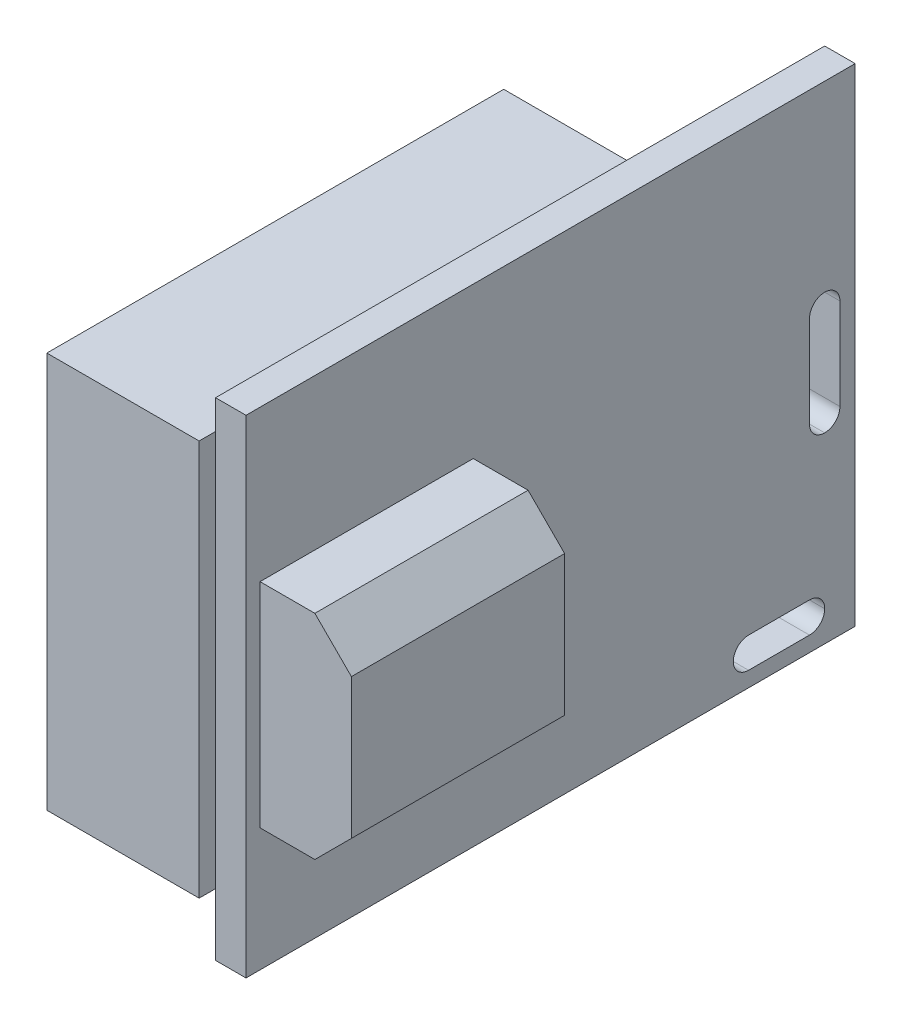
ISO-10303-21;
HEADER;
FILE_DESCRIPTION(('STEP AP214'),'2;1');
FILE_NAME('part.step','',(''),(''),'','','');
FILE_SCHEMA(('AUTOMOTIVE_DESIGN { 1 0 10303 214 1 1 1 1 }'));
ENDSEC;
DATA;
#1=APPLICATION_CONTEXT('core data for automotive mechanical design processes');
#2=APPLICATION_PROTOCOL_DEFINITION('international standard','automotive_design',2000,#1);
#3=PRODUCT_CONTEXT('',#1,'mechanical');
#4=PRODUCT('Part','Part','',(#3));
#5=PRODUCT_RELATED_PRODUCT_CATEGORY('part','',(#4));
#6=PRODUCT_DEFINITION_FORMATION('','',#4);
#7=PRODUCT_DEFINITION_CONTEXT('part definition',#1,'design');
#8=PRODUCT_DEFINITION('design','',#6,#7);
#9=PRODUCT_DEFINITION_SHAPE('','',#8);
#10=(LENGTH_UNIT() NAMED_UNIT(*) SI_UNIT(.MILLI.,.METRE.));
#11=(NAMED_UNIT(*) PLANE_ANGLE_UNIT() SI_UNIT($,.RADIAN.));
#12=(NAMED_UNIT(*) SI_UNIT($,.STERADIAN.) SOLID_ANGLE_UNIT());
#13=UNCERTAINTY_MEASURE_WITH_UNIT(LENGTH_MEASURE(1.E-05),#10,'distance_accuracy_value','');
#14=(GEOMETRIC_REPRESENTATION_CONTEXT(3) GLOBAL_UNCERTAINTY_ASSIGNED_CONTEXT((#13)) GLOBAL_UNIT_ASSIGNED_CONTEXT((#10,
#11,#12)) REPRESENTATION_CONTEXT('',''));
#15=CARTESIAN_POINT('',(0.,0.,0.));
#16=DIRECTION('',(0.,0.,1.));
#17=DIRECTION('',(1.,0.,0.));
#18=AXIS2_PLACEMENT_3D('',#15,#16,#17);
#19=CARTESIAN_POINT('',(7.5,-3.5,-7.));
#20=DIRECTION('',(0.,1.,0.));
#21=DIRECTION('',(-1.,0.,0.));
#22=AXIS2_PLACEMENT_3D('',#19,#20,#21);
#23=PLANE('',#22);
#24=DIRECTION('',(-1.,0.,0.));
#25=VECTOR('',#24,1.);
#26=CARTESIAN_POINT('',(7.5,-3.5,-7.));
#27=LINE('',#26,#25);
#28=CARTESIAN_POINT('',(6.3,-3.5,-7.));
#29=VERTEX_POINT('',#28);
#30=CARTESIAN_POINT('',(4.5,-3.5,-7.));
#31=VERTEX_POINT('',#30);
#32=EDGE_CURVE('E98',#29,#31,#27,.T.);
#33=ORIENTED_EDGE('',*,*,#32,.F.);
#34=DIRECTION('',(0.,0.,1.));
#35=VECTOR('',#34,1.);
#36=CARTESIAN_POINT('',(6.3,-3.5,0.));
#37=LINE('',#36,#35);
#38=CARTESIAN_POINT('',(6.3,-3.5,0.));
#39=VERTEX_POINT('',#38);
#40=EDGE_CURVE('E122',#29,#39,#37,.T.);
#41=ORIENTED_EDGE('',*,*,#40,.T.);
#42=DIRECTION('',(-1.,0.,0.));
#43=VECTOR('',#42,1.);
#44=CARTESIAN_POINT('',(7.5,-3.5,0.));
#45=LINE('',#44,#43);
#46=CARTESIAN_POINT('',(4.5,-3.5,0.));
#47=VERTEX_POINT('',#46);
#48=EDGE_CURVE('E120',#39,#47,#45,.T.);
#49=ORIENTED_EDGE('',*,*,#48,.T.);
#50=DIRECTION('',(0.,0.,1.));
#51=VECTOR('',#50,1.);
#52=CARTESIAN_POINT('',(4.5,-3.5,-7.));
#53=LINE('',#52,#51);
#54=EDGE_CURVE('E114',#31,#47,#53,.T.);
#55=ORIENTED_EDGE('',*,*,#54,.F.);
#56=EDGE_LOOP('',(#33,#41,#49,#55));
#57=FACE_BOUND('',#56,.T.);
#58=ADVANCED_FACE('F46',(#57),#23,.F.);
#59=CARTESIAN_POINT('',(4.5,-3.5,-7.));
#60=DIRECTION('',(1.,0.,0.));
#61=DIRECTION('',(0.,0.,-1.));
#62=AXIS2_PLACEMENT_3D('',#59,#60,#61);
#63=PLANE('',#62);
#64=DIRECTION('',(0.,1.,0.));
#65=VECTOR('',#64,1.);
#66=CARTESIAN_POINT('',(4.5,-3.5,0.));
#67=LINE('',#66,#65);
#68=CARTESIAN_POINT('',(4.5,3.5,0.));
#69=VERTEX_POINT('',#68);
#70=EDGE_CURVE('E149',#47,#69,#67,.T.);
#71=ORIENTED_EDGE('',*,*,#70,.T.);
#72=DIRECTION('',(0.,0.,1.));
#73=VECTOR('',#72,1.);
#74=CARTESIAN_POINT('',(4.5,3.5,-7.));
#75=LINE('',#74,#73);
#76=CARTESIAN_POINT('',(4.5,3.5,-7.));
#77=VERTEX_POINT('',#76);
#78=EDGE_CURVE('E116',#77,#69,#75,.T.);
#79=ORIENTED_EDGE('',*,*,#78,.F.);
#80=DIRECTION('',(0.,1.,0.));
#81=VECTOR('',#80,1.);
#82=CARTESIAN_POINT('',(4.5,-3.5,-7.));
#83=LINE('',#82,#81);
#84=EDGE_CURVE('E101',#31,#77,#83,.T.);
#85=ORIENTED_EDGE('',*,*,#84,.F.);
#86=ORIENTED_EDGE('',*,*,#54,.T.);
#87=EDGE_LOOP('',(#71,#79,#85,#86));
#88=FACE_BOUND('',#87,.T.);
#89=ADVANCED_FACE('F113',(#88),#63,.F.);
#90=CARTESIAN_POINT('',(7.5,3.5,-7.));
#91=DIRECTION('',(0.,1.,0.));
#92=DIRECTION('',(-1.,0.,0.));
#93=AXIS2_PLACEMENT_3D('',#90,#91,#92);
#94=PLANE('',#93);
#95=DIRECTION('',(-1.,0.,0.));
#96=VECTOR('',#95,1.);
#97=CARTESIAN_POINT('',(7.5,3.5,0.));
#98=LINE('',#97,#96);
#99=CARTESIAN_POINT('',(6.29999999999999,3.5,0.));
#100=VERTEX_POINT('',#99);
#101=EDGE_CURVE('E151',#100,#69,#98,.T.);
#102=ORIENTED_EDGE('',*,*,#101,.F.);
#103=DIRECTION('',(0.,0.,-1.));
#104=VECTOR('',#103,1.);
#105=CARTESIAN_POINT('',(6.29999999999999,3.5,-7.));
#106=LINE('',#105,#104);
#107=CARTESIAN_POINT('',(6.29999999999999,3.5,-7.));
#108=VERTEX_POINT('',#107);
#109=EDGE_CURVE('E12',#100,#108,#106,.T.);
#110=ORIENTED_EDGE('',*,*,#109,.T.);
#111=DIRECTION('',(-1.,0.,0.));
#112=VECTOR('',#111,1.);
#113=CARTESIAN_POINT('',(7.5,3.5,-7.));
#114=LINE('',#113,#112);
#115=EDGE_CURVE('E117',#108,#77,#114,.T.);
#116=ORIENTED_EDGE('',*,*,#115,.T.);
#117=ORIENTED_EDGE('',*,*,#78,.T.);
#118=EDGE_LOOP('',(#102,#110,#116,#117));
#119=FACE_BOUND('',#118,.T.);
#120=ADVANCED_FACE('F156',(#119),#94,.T.);
#121=CARTESIAN_POINT('',(7.5,-3.5,-7.));
#122=DIRECTION('',(1.,0.,0.));
#123=DIRECTION('',(0.,0.,-1.));
#124=AXIS2_PLACEMENT_3D('',#121,#122,#123);
#125=PLANE('',#124);
#126=DIRECTION('',(0.,1.,0.));
#127=VECTOR('',#126,1.);
#128=CARTESIAN_POINT('',(7.5,-3.5,0.));
#129=LINE('',#128,#127);
#130=CARTESIAN_POINT('',(7.5,-2.29999999999999,0.));
#131=VERTEX_POINT('',#130);
#132=CARTESIAN_POINT('',(7.5,2.3,0.));
#133=VERTEX_POINT('',#132);
#134=EDGE_CURVE('E108',#131,#133,#129,.T.);
#135=ORIENTED_EDGE('',*,*,#134,.F.);
#136=DIRECTION('',(0.,0.,-1.));
#137=VECTOR('',#136,1.);
#138=CARTESIAN_POINT('',(7.5,-2.29999999999999,-7.));
#139=LINE('',#138,#137);
#140=CARTESIAN_POINT('',(7.5,-2.29999999999999,-7.));
#141=VERTEX_POINT('',#140);
#142=EDGE_CURVE('E136',#131,#141,#139,.T.);
#143=ORIENTED_EDGE('',*,*,#142,.T.);
#144=DIRECTION('',(0.,1.,0.));
#145=VECTOR('',#144,1.);
#146=CARTESIAN_POINT('',(7.5,-3.5,-7.));
#147=LINE('',#146,#145);
#148=CARTESIAN_POINT('',(7.5,2.3,-7.));
#149=VERTEX_POINT('',#148);
#150=EDGE_CURVE('E126',#141,#149,#147,.T.);
#151=ORIENTED_EDGE('',*,*,#150,.T.);
#152=DIRECTION('',(0.,0.,1.));
#153=VECTOR('',#152,1.);
#154=CARTESIAN_POINT('',(7.5,2.3,-7.));
#155=LINE('',#154,#153);
#156=EDGE_CURVE('E133',#149,#133,#155,.T.);
#157=ORIENTED_EDGE('',*,*,#156,.T.);
#158=EDGE_LOOP('',(#135,#143,#151,#157));
#159=FACE_BOUND('',#158,.T.);
#160=ADVANCED_FACE('F141',(#159),#125,.T.);
#161=CARTESIAN_POINT('',(0.,0.,-7.));
#162=DIRECTION('',(0.,0.,-1.));
#163=DIRECTION('',(-1.,0.,0.));
#164=AXIS2_PLACEMENT_3D('',#161,#162,#163);
#165=PLANE('',#164);
#166=ORIENTED_EDGE('',*,*,#150,.F.);
#167=DIRECTION('',(-0.707106781186546,-0.707106781186549,0.));
#168=VECTOR('',#167,1.);
#169=CARTESIAN_POINT('',(4.90000000000002,-4.89999999999999,-7.));
#170=LINE('',#169,#168);
#171=EDGE_CURVE('E54',#141,#29,#170,.T.);
#172=ORIENTED_EDGE('',*,*,#171,.T.);
#173=ORIENTED_EDGE('',*,*,#32,.T.);
#174=ORIENTED_EDGE('',*,*,#84,.T.);
#175=ORIENTED_EDGE('',*,*,#115,.F.);
#176=DIRECTION('',(-0.707106781186549,0.707106781186546,0.));
#177=VECTOR('',#176,1.);
#178=CARTESIAN_POINT('',(4.89999999999998,4.90000000000001,-7.));
#179=LINE('',#178,#177);
#180=EDGE_CURVE('E66',#108,#149,#179,.F.);
#181=ORIENTED_EDGE('',*,*,#180,.T.);
#182=EDGE_LOOP('',(#166,#172,#173,#174,#175,#181));
#183=FACE_BOUND('',#182,.T.);
#184=ADVANCED_FACE('F100',(#183),#165,.T.);
#185=CARTESIAN_POINT('',(0.,0.,0.));
#186=DIRECTION('',(0.,0.,-1.));
#187=DIRECTION('',(-1.,0.,0.));
#188=AXIS2_PLACEMENT_3D('',#185,#186,#187);
#189=PLANE('',#188);
#190=ORIENTED_EDGE('',*,*,#48,.F.);
#191=DIRECTION('',(0.707106781186546,0.707106781186549,0.));
#192=VECTOR('',#191,1.);
#193=CARTESIAN_POINT('',(6.3,-3.5,0.));
#194=LINE('',#193,#192);
#195=EDGE_CURVE('E131',#39,#131,#194,.T.);
#196=ORIENTED_EDGE('',*,*,#195,.T.);
#197=ORIENTED_EDGE('',*,*,#134,.T.);
#198=DIRECTION('',(0.707106781186549,-0.707106781186546,0.));
#199=VECTOR('',#198,1.);
#200=CARTESIAN_POINT('',(7.5,2.3,0.));
#201=LINE('',#200,#199);
#202=EDGE_CURVE('E124',#133,#100,#201,.F.);
#203=ORIENTED_EDGE('',*,*,#202,.T.);
#204=ORIENTED_EDGE('',*,*,#101,.T.);
#205=ORIENTED_EDGE('',*,*,#70,.F.);
#206=EDGE_LOOP('',(#190,#196,#197,#203,#204,#205));
#207=FACE_BOUND('',#206,.T.);
#208=ADVANCED_FACE('F148',(#207),#189,.F.);
#209=CARTESIAN_POINT('',(6.3,-3.5,-7.));
#210=DIRECTION('',(0.707106781186549,-0.707106781186546,0.));
#211=DIRECTION('',(0.,0.,-1.));
#212=AXIS2_PLACEMENT_3D('',#209,#210,#211);
#213=PLANE('',#212);
#214=ORIENTED_EDGE('',*,*,#171,.F.);
#215=ORIENTED_EDGE('',*,*,#142,.F.);
#216=ORIENTED_EDGE('',*,*,#195,.F.);
#217=ORIENTED_EDGE('',*,*,#40,.F.);
#218=EDGE_LOOP('',(#214,#215,#216,#217));
#219=FACE_BOUND('',#218,.T.);
#220=ADVANCED_FACE('F146',(#219),#213,.T.);
#221=CARTESIAN_POINT('',(7.5,2.3,-7.));
#222=DIRECTION('',(-0.707106781186546,-0.707106781186549,0.));
#223=DIRECTION('',(0.,0.,1.));
#224=AXIS2_PLACEMENT_3D('',#221,#222,#223);
#225=PLANE('',#224);
#226=ORIENTED_EDGE('',*,*,#180,.F.);
#227=ORIENTED_EDGE('',*,*,#109,.F.);
#228=ORIENTED_EDGE('',*,*,#202,.F.);
#229=ORIENTED_EDGE('',*,*,#156,.F.);
#230=EDGE_LOOP('',(#226,#227,#228,#229));
#231=FACE_BOUND('',#230,.T.);
#232=ADVANCED_FACE('F48',(#231),#225,.F.);
#233=CLOSED_SHELL('',(#58,#89,#120,#160,#184,#208,#220,#232));
#234=MANIFOLD_SOLID_BREP('B2',#233);
#235=CARTESIAN_POINT('',(-2.5,-6.5,-15.));
#236=DIRECTION('',(1.,0.,0.));
#237=DIRECTION('',(0.,0.,-1.));
#238=AXIS2_PLACEMENT_3D('',#235,#236,#237);
#239=PLANE('',#238);
#240=DIRECTION('',(0.,1.,0.));
#241=VECTOR('',#240,1.);
#242=CARTESIAN_POINT('',(-2.5,-6.5,0.));
#243=LINE('',#242,#241);
#244=CARTESIAN_POINT('',(-2.5,-6.5,0.));
#245=VERTEX_POINT('',#244);
#246=CARTESIAN_POINT('',(-2.5,6.5,0.));
#247=VERTEX_POINT('',#246);
#248=EDGE_CURVE('E293',#245,#247,#243,.T.);
#249=ORIENTED_EDGE('',*,*,#248,.T.);
#250=DIRECTION('',(0.,0.,1.));
#251=VECTOR('',#250,1.);
#252=CARTESIAN_POINT('',(-2.5,6.5,-15.));
#253=LINE('',#252,#251);
#254=CARTESIAN_POINT('',(-2.5,6.5,-15.));
#255=VERTEX_POINT('',#254);
#256=EDGE_CURVE('E44',#255,#247,#253,.T.);
#257=ORIENTED_EDGE('',*,*,#256,.F.);
#258=DIRECTION('',(0.,1.,0.));
#259=VECTOR('',#258,1.);
#260=CARTESIAN_POINT('',(-2.5,-6.5,-15.));
#261=LINE('',#260,#259);
#262=CARTESIAN_POINT('',(-2.5,-6.5,-15.));
#263=VERTEX_POINT('',#262);
#264=EDGE_CURVE('E279',#263,#255,#261,.T.);
#265=ORIENTED_EDGE('',*,*,#264,.F.);
#266=DIRECTION('',(0.,0.,1.));
#267=VECTOR('',#266,1.);
#268=CARTESIAN_POINT('',(-2.5,-6.5,-15.));
#269=LINE('',#268,#267);
#270=EDGE_CURVE('E246',#263,#245,#269,.T.);
#271=ORIENTED_EDGE('',*,*,#270,.T.);
#272=EDGE_LOOP('',(#249,#257,#265,#271));
#273=FACE_BOUND('',#272,.T.);
#274=ADVANCED_FACE('F230',(#273),#239,.F.);
#275=CARTESIAN_POINT('',(-2.5,6.5,-15.));
#276=DIRECTION('',(0.,-1.,0.));
#277=DIRECTION('',(0.,0.,-1.));
#278=AXIS2_PLACEMENT_3D('',#275,#276,#277);
#279=PLANE('',#278);
#280=DIRECTION('',(1.,0.,0.));
#281=VECTOR('',#280,1.);
#282=CARTESIAN_POINT('',(-2.5,6.5,0.));
#283=LINE('',#282,#281);
#284=CARTESIAN_POINT('',(2.5,6.5,0.));
#285=VERTEX_POINT('',#284);
#286=EDGE_CURVE('E284',#247,#285,#283,.T.);
#287=ORIENTED_EDGE('',*,*,#286,.T.);
#288=DIRECTION('',(0.,0.,1.));
#289=VECTOR('',#288,1.);
#290=CARTESIAN_POINT('',(2.5,6.5,-15.));
#291=LINE('',#290,#289);
#292=CARTESIAN_POINT('',(2.5,6.5,-15.));
#293=VERTEX_POINT('',#292);
#294=EDGE_CURVE('E238',#293,#285,#291,.T.);
#295=ORIENTED_EDGE('',*,*,#294,.F.);
#296=DIRECTION('',(1.,0.,0.));
#297=VECTOR('',#296,1.);
#298=CARTESIAN_POINT('',(-2.5,6.5,-15.));
#299=LINE('',#298,#297);
#300=EDGE_CURVE('E271',#255,#293,#299,.T.);
#301=ORIENTED_EDGE('',*,*,#300,.F.);
#302=ORIENTED_EDGE('',*,*,#256,.T.);
#303=EDGE_LOOP('',(#287,#295,#301,#302));
#304=FACE_BOUND('',#303,.T.);
#305=ADVANCED_FACE('F283',(#304),#279,.F.);
#306=CARTESIAN_POINT('',(2.5,-6.5,-15.));
#307=DIRECTION('',(1.,0.,0.));
#308=DIRECTION('',(0.,0.,-1.));
#309=AXIS2_PLACEMENT_3D('',#306,#307,#308);
#310=PLANE('',#309);
#311=DIRECTION('',(0.,1.,0.));
#312=VECTOR('',#311,1.);
#313=CARTESIAN_POINT('',(2.5,-6.5,0.));
#314=LINE('',#313,#312);
#315=CARTESIAN_POINT('',(2.5,-6.5,0.));
#316=VERTEX_POINT('',#315);
#317=EDGE_CURVE('E296',#316,#285,#314,.T.);
#318=ORIENTED_EDGE('',*,*,#317,.F.);
#319=DIRECTION('',(0.,0.,1.));
#320=VECTOR('',#319,1.);
#321=CARTESIAN_POINT('',(2.5,-6.5,-15.));
#322=LINE('',#321,#320);
#323=CARTESIAN_POINT('',(2.5,-6.5,-15.));
#324=VERTEX_POINT('',#323);
#325=EDGE_CURVE('E260',#324,#316,#322,.T.);
#326=ORIENTED_EDGE('',*,*,#325,.F.);
#327=DIRECTION('',(0.,1.,0.));
#328=VECTOR('',#327,1.);
#329=CARTESIAN_POINT('',(2.5,-6.5,-15.));
#330=LINE('',#329,#328);
#331=EDGE_CURVE('E278',#324,#293,#330,.T.);
#332=ORIENTED_EDGE('',*,*,#331,.T.);
#333=ORIENTED_EDGE('',*,*,#294,.T.);
#334=EDGE_LOOP('',(#318,#326,#332,#333));
#335=FACE_BOUND('',#334,.T.);
#336=ADVANCED_FACE('F287',(#335),#310,.T.);
#337=CARTESIAN_POINT('',(-2.5,-6.5,-15.));
#338=DIRECTION('',(0.,-1.,0.));
#339=DIRECTION('',(0.,0.,-1.));
#340=AXIS2_PLACEMENT_3D('',#337,#338,#339);
#341=PLANE('',#340);
#342=DIRECTION('',(1.,0.,0.));
#343=VECTOR('',#342,1.);
#344=CARTESIAN_POINT('',(-2.5,-6.5,0.));
#345=LINE('',#344,#343);
#346=EDGE_CURVE('E298',#245,#316,#345,.T.);
#347=ORIENTED_EDGE('',*,*,#346,.F.);
#348=ORIENTED_EDGE('',*,*,#270,.F.);
#349=DIRECTION('',(1.,0.,0.));
#350=VECTOR('',#349,1.);
#351=CARTESIAN_POINT('',(-2.5,-6.5,-15.));
#352=LINE('',#351,#350);
#353=EDGE_CURVE('E288',#263,#324,#352,.T.);
#354=ORIENTED_EDGE('',*,*,#353,.T.);
#355=ORIENTED_EDGE('',*,*,#325,.T.);
#356=EDGE_LOOP('',(#347,#348,#354,#355));
#357=FACE_BOUND('',#356,.T.);
#358=ADVANCED_FACE('F304',(#357),#341,.T.);
#359=CARTESIAN_POINT('',(0.,0.,-15.));
#360=DIRECTION('',(0.,0.,-1.));
#361=DIRECTION('',(-1.,0.,0.));
#362=AXIS2_PLACEMENT_3D('',#359,#360,#361);
#363=PLANE('',#362);
#364=ORIENTED_EDGE('',*,*,#264,.T.);
#365=ORIENTED_EDGE('',*,*,#300,.T.);
#366=ORIENTED_EDGE('',*,*,#331,.F.);
#367=ORIENTED_EDGE('',*,*,#353,.F.);
#368=EDGE_LOOP('',(#364,#365,#366,#367));
#369=FACE_BOUND('',#368,.T.);
#370=ADVANCED_FACE('F275',(#369),#363,.T.);
#371=CARTESIAN_POINT('',(0.,0.,0.));
#372=DIRECTION('',(0.,0.,-1.));
#373=DIRECTION('',(-1.,0.,0.));
#374=AXIS2_PLACEMENT_3D('',#371,#372,#373);
#375=PLANE('',#374);
#376=ORIENTED_EDGE('',*,*,#248,.F.);
#377=ORIENTED_EDGE('',*,*,#346,.T.);
#378=ORIENTED_EDGE('',*,*,#317,.T.);
#379=ORIENTED_EDGE('',*,*,#286,.F.);
#380=EDGE_LOOP('',(#376,#377,#378,#379));
#381=FACE_BOUND('',#380,.T.);
#382=ADVANCED_FACE('F303',(#381),#375,.F.);
#383=CLOSED_SHELL('',(#274,#305,#336,#358,#370,#382));
#384=MANIFOLD_SOLID_BREP('B6',#383);
#385=CARTESIAN_POINT('',(3.03907819183488,0.,-20.));
#386=DIRECTION('',(1.,0.,0.));
#387=DIRECTION('',(0.,0.,-1.));
#388=AXIS2_PLACEMENT_3D('',#385,#386,#387);
#389=PLANE('',#388);
#390=DIRECTION('',(0.,1.,0.));
#391=VECTOR('',#390,1.);
#392=CARTESIAN_POINT('',(3.03907819183488,0.,-19.5));
#393=LINE('',#392,#391);
#394=CARTESIAN_POINT('',(3.03907819183488,-1.5,-19.5));
#395=VERTEX_POINT('',#394);
#396=CARTESIAN_POINT('',(3.03907819183488,1.5,-19.5));
#397=VERTEX_POINT('',#396);
#398=EDGE_CURVE('E584',#395,#397,#393,.T.);
#399=ORIENTED_EDGE('',*,*,#398,.T.);
#400=CARTESIAN_POINT('',(3.03907819183488,1.5,-19.));
#401=DIRECTION('',(1.,0.,0.));
#402=DIRECTION('',(0.,0.,-1.));
#403=AXIS2_PLACEMENT_3D('',#400,#401,#402);
#404=CIRCLE('',#403,0.5);
#405=CARTESIAN_POINT('',(3.03907819183488,2.,-19.));
#406=VERTEX_POINT('',#405);
#407=EDGE_CURVE('E541',#397,#406,#404,.T.);
#408=ORIENTED_EDGE('',*,*,#407,.T.);
#409=CARTESIAN_POINT('',(3.03907819183488,1.5,-19.));
#410=DIRECTION('',(1.,0.,0.));
#411=DIRECTION('',(0.,0.,-1.));
#412=AXIS2_PLACEMENT_3D('',#409,#410,#411);
#413=CIRCLE('',#412,0.5);
#414=CARTESIAN_POINT('',(3.03907819183488,1.5,-18.5));
#415=VERTEX_POINT('',#414);
#416=EDGE_CURVE('E537',#406,#415,#413,.T.);
#417=ORIENTED_EDGE('',*,*,#416,.T.);
#418=DIRECTION('',(0.,-1.,0.));
#419=VECTOR('',#418,1.);
#420=CARTESIAN_POINT('',(3.03907819183488,0.,-18.5));
#421=LINE('',#420,#419);
#422=CARTESIAN_POINT('',(3.03907819183488,-1.5,-18.5));
#423=VERTEX_POINT('',#422);
#424=EDGE_CURVE('E497',#415,#423,#421,.T.);
#425=ORIENTED_EDGE('',*,*,#424,.T.);
#426=CARTESIAN_POINT('',(3.03907819183488,-1.5,-19.));
#427=DIRECTION('',(1.,0.,0.));
#428=DIRECTION('',(0.,0.,-1.));
#429=AXIS2_PLACEMENT_3D('',#426,#427,#428);
#430=CIRCLE('',#429,0.5);
#431=CARTESIAN_POINT('',(3.03907819183488,-2.,-19.));
#432=VERTEX_POINT('',#431);
#433=EDGE_CURVE('E533',#423,#432,#430,.T.);
#434=ORIENTED_EDGE('',*,*,#433,.T.);
#435=CARTESIAN_POINT('',(3.03907819183488,-1.5,-19.));
#436=DIRECTION('',(1.,0.,0.));
#437=DIRECTION('',(0.,0.,-1.));
#438=AXIS2_PLACEMENT_3D('',#435,#436,#437);
#439=CIRCLE('',#438,0.5);
#440=EDGE_CURVE('E545',#432,#395,#439,.T.);
#441=ORIENTED_EDGE('',*,*,#440,.T.);
#442=EDGE_LOOP('',(#399,#408,#417,#425,#434,#441));
#443=FACE_BOUND('',#442,.T.);
#444=CARTESIAN_POINT('',(3.03907819183488,-7.,-16.5));
#445=DIRECTION('',(1.,0.,0.));
#446=DIRECTION('',(0.,0.,-1.));
#447=AXIS2_PLACEMENT_3D('',#444,#445,#446);
#448=CIRCLE('',#447,0.5);
#449=CARTESIAN_POINT('',(3.03907819183488,-6.5,-16.5));
#450=VERTEX_POINT('',#449);
#451=CARTESIAN_POINT('',(3.03907819183488,-7.,-16.));
#452=VERTEX_POINT('',#451);
#453=EDGE_CURVE('E369',#450,#452,#448,.T.);
#454=ORIENTED_EDGE('',*,*,#453,.T.);
#455=CARTESIAN_POINT('',(3.03907819183488,-7.,-16.5));
#456=DIRECTION('',(1.,0.,0.));
#457=DIRECTION('',(0.,0.,-1.));
#458=AXIS2_PLACEMENT_3D('',#455,#456,#457);
#459=CIRCLE('',#458,0.5);
#460=CARTESIAN_POINT('',(3.03907819183488,-7.5,-16.5));
#461=VERTEX_POINT('',#460);
#462=EDGE_CURVE('E228',#452,#461,#459,.T.);
#463=ORIENTED_EDGE('',*,*,#462,.T.);
#464=DIRECTION('',(0.,0.,-1.));
#465=VECTOR('',#464,1.);
#466=CARTESIAN_POINT('',(3.03907819183488,-7.5,-20.));
#467=LINE('',#466,#465);
#468=CARTESIAN_POINT('',(3.03907819183488,-7.5,-18.5));
#469=VERTEX_POINT('',#468);
#470=EDGE_CURVE('E579',#461,#469,#467,.T.);
#471=ORIENTED_EDGE('',*,*,#470,.T.);
#472=CARTESIAN_POINT('',(3.03907819183488,-7.,-18.5));
#473=DIRECTION('',(1.,0.,0.));
#474=DIRECTION('',(0.,0.,-1.));
#475=AXIS2_PLACEMENT_3D('',#472,#473,#474);
#476=CIRCLE('',#475,0.5);
#477=CARTESIAN_POINT('',(3.03907819183488,-7.,-19.));
#478=VERTEX_POINT('',#477);
#479=EDGE_CURVE('E549',#469,#478,#476,.T.);
#480=ORIENTED_EDGE('',*,*,#479,.T.);
#481=CARTESIAN_POINT('',(3.03907819183488,-7.,-18.5));
#482=DIRECTION('',(1.,0.,0.));
#483=DIRECTION('',(0.,0.,-1.));
#484=AXIS2_PLACEMENT_3D('',#481,#482,#483);
#485=CIRCLE('',#484,0.5);
#486=CARTESIAN_POINT('',(3.03907819183488,-6.5,-18.5));
#487=VERTEX_POINT('',#486);
#488=EDGE_CURVE('E553',#478,#487,#485,.T.);
#489=ORIENTED_EDGE('',*,*,#488,.T.);
#490=DIRECTION('',(0.,0.,1.));
#491=VECTOR('',#490,1.);
#492=CARTESIAN_POINT('',(3.03907819183488,-6.5,-20.));
#493=LINE('',#492,#491);
#494=EDGE_CURVE('E585',#487,#450,#493,.T.);
#495=ORIENTED_EDGE('',*,*,#494,.T.);
#496=EDGE_LOOP('',(#454,#463,#471,#480,#489,#495));
#497=FACE_BOUND('',#496,.T.);
#498=DIRECTION('',(0.,1.,0.));
#499=VECTOR('',#498,1.);
#500=CARTESIAN_POINT('',(3.03907819183488,0.,0.));
#501=LINE('',#500,#499);
#502=CARTESIAN_POINT('',(3.03907819183488,-8.,0.));
#503=VERTEX_POINT('',#502);
#504=CARTESIAN_POINT('',(3.03907819183488,8.,0.));
#505=VERTEX_POINT('',#504);
#506=EDGE_CURVE('E502',#503,#505,#501,.T.);
#507=ORIENTED_EDGE('',*,*,#506,.T.);
#508=DIRECTION('',(0.,0.,1.));
#509=VECTOR('',#508,1.);
#510=CARTESIAN_POINT('',(3.03907819183488,8.,-20.));
#511=LINE('',#510,#509);
#512=CARTESIAN_POINT('',(3.03907819183488,8.,-20.));
#513=VERTEX_POINT('',#512);
#514=EDGE_CURVE('E489',#513,#505,#511,.T.);
#515=ORIENTED_EDGE('',*,*,#514,.F.);
#516=DIRECTION('',(0.,1.,0.));
#517=VECTOR('',#516,1.);
#518=CARTESIAN_POINT('',(3.03907819183488,0.,-20.));
#519=LINE('',#518,#517);
#520=CARTESIAN_POINT('',(3.03907819183488,-8.,-20.));
#521=VERTEX_POINT('',#520);
#522=EDGE_CURVE('E472',#521,#513,#519,.T.);
#523=ORIENTED_EDGE('',*,*,#522,.F.);
#524=DIRECTION('',(0.,0.,1.));
#525=VECTOR('',#524,1.);
#526=CARTESIAN_POINT('',(3.03907819183488,-8.,-20.));
#527=LINE('',#526,#525);
#528=EDGE_CURVE('E479',#521,#503,#527,.T.);
#529=ORIENTED_EDGE('',*,*,#528,.T.);
#530=EDGE_LOOP('',(#507,#515,#523,#529));
#531=FACE_BOUND('',#530,.T.);
#532=ADVANCED_FACE('F353',(#443,#497,#531),#389,.F.);
#533=CARTESIAN_POINT('',(0.,8.,-20.));
#534=DIRECTION('',(0.,1.,0.));
#535=DIRECTION('',(0.,0.,1.));
#536=AXIS2_PLACEMENT_3D('',#533,#534,#535);
#537=PLANE('',#536);
#538=DIRECTION('',(-1.,0.,0.));
#539=VECTOR('',#538,1.);
#540=CARTESIAN_POINT('',(0.,8.,0.));
#541=LINE('',#540,#539);
#542=CARTESIAN_POINT('',(4.03907819183488,8.,0.));
#543=VERTEX_POINT('',#542);
#544=EDGE_CURVE('E491',#543,#505,#541,.T.);
#545=ORIENTED_EDGE('',*,*,#544,.F.);
#546=DIRECTION('',(0.,0.,1.));
#547=VECTOR('',#546,1.);
#548=CARTESIAN_POINT('',(4.03907819183488,8.,-20.));
#549=LINE('',#548,#547);
#550=CARTESIAN_POINT('',(4.03907819183488,8.,-20.));
#551=VERTEX_POINT('',#550);
#552=EDGE_CURVE('E509',#551,#543,#549,.T.);
#553=ORIENTED_EDGE('',*,*,#552,.F.);
#554=DIRECTION('',(-1.,0.,0.));
#555=VECTOR('',#554,1.);
#556=CARTESIAN_POINT('',(0.,8.,-20.));
#557=LINE('',#556,#555);
#558=EDGE_CURVE('E487',#551,#513,#557,.T.);
#559=ORIENTED_EDGE('',*,*,#558,.T.);
#560=ORIENTED_EDGE('',*,*,#514,.T.);
#561=EDGE_LOOP('',(#545,#553,#559,#560));
#562=FACE_BOUND('',#561,.T.);
#563=ADVANCED_FACE('F644',(#562),#537,.T.);
#564=CARTESIAN_POINT('',(4.03907819183488,0.,-20.));
#565=DIRECTION('',(1.,0.,0.));
#566=DIRECTION('',(0.,0.,-1.));
#567=AXIS2_PLACEMENT_3D('',#564,#565,#566);
#568=PLANE('',#567);
#569=CARTESIAN_POINT('',(4.03907819183488,1.5,-19.));
#570=DIRECTION('',(1.,0.,0.));
#571=DIRECTION('',(0.,0.,-1.));
#572=AXIS2_PLACEMENT_3D('',#569,#570,#571);
#573=CIRCLE('',#572,0.5);
#574=CARTESIAN_POINT('',(4.03907819183488,1.5,-18.5));
#575=VERTEX_POINT('',#574);
#576=CARTESIAN_POINT('',(4.03907819183488,2.,-19.));
#577=VERTEX_POINT('',#576);
#578=EDGE_CURVE('E535',#575,#577,#573,.F.);
#579=ORIENTED_EDGE('',*,*,#578,.T.);
#580=CARTESIAN_POINT('',(4.03907819183488,1.5,-19.));
#581=DIRECTION('',(1.,0.,0.));
#582=DIRECTION('',(0.,0.,-1.));
#583=AXIS2_PLACEMENT_3D('',#580,#581,#582);
#584=CIRCLE('',#583,0.5);
#585=CARTESIAN_POINT('',(4.03907819183488,1.5,-19.5));
#586=VERTEX_POINT('',#585);
#587=EDGE_CURVE('E539',#577,#586,#584,.F.);
#588=ORIENTED_EDGE('',*,*,#587,.T.);
#589=DIRECTION('',(0.,1.,0.));
#590=VECTOR('',#589,1.);
#591=CARTESIAN_POINT('',(4.03907819183488,-2.,-19.5));
#592=LINE('',#591,#590);
#593=CARTESIAN_POINT('',(4.03907819183488,-1.5,-19.5));
#594=VERTEX_POINT('',#593);
#595=EDGE_CURVE('E588',#594,#586,#592,.T.);
#596=ORIENTED_EDGE('',*,*,#595,.F.);
#597=CARTESIAN_POINT('',(4.03907819183488,-1.5,-19.));
#598=DIRECTION('',(1.,0.,0.));
#599=DIRECTION('',(0.,0.,-1.));
#600=AXIS2_PLACEMENT_3D('',#597,#598,#599);
#601=CIRCLE('',#600,0.5);
#602=CARTESIAN_POINT('',(4.03907819183488,-2.,-19.));
#603=VERTEX_POINT('',#602);
#604=EDGE_CURVE('E543',#594,#603,#601,.F.);
#605=ORIENTED_EDGE('',*,*,#604,.T.);
#606=CARTESIAN_POINT('',(4.03907819183488,-1.5,-19.));
#607=DIRECTION('',(1.,0.,0.));
#608=DIRECTION('',(0.,0.,-1.));
#609=AXIS2_PLACEMENT_3D('',#606,#607,#608);
#610=CIRCLE('',#609,0.5);
#611=CARTESIAN_POINT('',(4.03907819183488,-1.5,-18.5));
#612=VERTEX_POINT('',#611);
#613=EDGE_CURVE('E531',#603,#612,#610,.F.);
#614=ORIENTED_EDGE('',*,*,#613,.T.);
#615=DIRECTION('',(0.,-1.,0.));
#616=VECTOR('',#615,1.);
#617=CARTESIAN_POINT('',(4.03907819183488,-2.,-18.5));
#618=LINE('',#617,#616);
#619=EDGE_CURVE('E593',#575,#612,#618,.T.);
#620=ORIENTED_EDGE('',*,*,#619,.F.);
#621=EDGE_LOOP('',(#579,#588,#596,#605,#614,#620));
#622=FACE_BOUND('',#621,.T.);
#623=DIRECTION('',(0.,0.,1.));
#624=VECTOR('',#623,1.);
#625=CARTESIAN_POINT('',(4.03907819183488,-6.5,-16.));
#626=LINE('',#625,#624);
#627=CARTESIAN_POINT('',(4.03907819183488,-6.5,-18.5));
#628=VERTEX_POINT('',#627);
#629=CARTESIAN_POINT('',(4.03907819183488,-6.5,-16.5));
#630=VERTEX_POINT('',#629);
#631=EDGE_CURVE('E562',#628,#630,#626,.T.);
#632=ORIENTED_EDGE('',*,*,#631,.F.);
#633=CARTESIAN_POINT('',(4.03907819183488,-7.,-18.5));
#634=DIRECTION('',(1.,0.,0.));
#635=DIRECTION('',(0.,0.,-1.));
#636=AXIS2_PLACEMENT_3D('',#633,#634,#635);
#637=CIRCLE('',#636,0.5);
#638=CARTESIAN_POINT('',(4.03907819183488,-7.,-19.));
#639=VERTEX_POINT('',#638);
#640=EDGE_CURVE('E551',#628,#639,#637,.F.);
#641=ORIENTED_EDGE('',*,*,#640,.T.);
#642=CARTESIAN_POINT('',(4.03907819183488,-7.,-18.5));
#643=DIRECTION('',(1.,0.,0.));
#644=DIRECTION('',(0.,0.,-1.));
#645=AXIS2_PLACEMENT_3D('',#642,#643,#644);
#646=CIRCLE('',#645,0.5);
#647=CARTESIAN_POINT('',(4.03907819183488,-7.5,-18.5));
#648=VERTEX_POINT('',#647);
#649=EDGE_CURVE('E547',#639,#648,#646,.F.);
#650=ORIENTED_EDGE('',*,*,#649,.T.);
#651=DIRECTION('',(0.,0.,-1.));
#652=VECTOR('',#651,1.);
#653=CARTESIAN_POINT('',(4.03907819183488,-7.5,-16.));
#654=LINE('',#653,#652);
#655=CARTESIAN_POINT('',(4.03907819183488,-7.5,-16.5));
#656=VERTEX_POINT('',#655);
#657=EDGE_CURVE('E591',#656,#648,#654,.T.);
#658=ORIENTED_EDGE('',*,*,#657,.F.);
#659=CARTESIAN_POINT('',(4.03907819183488,-7.,-16.5));
#660=DIRECTION('',(1.,0.,0.));
#661=DIRECTION('',(0.,0.,-1.));
#662=AXIS2_PLACEMENT_3D('',#659,#660,#661);
#663=CIRCLE('',#662,0.5);
#664=CARTESIAN_POINT('',(4.03907819183488,-7.,-16.));
#665=VERTEX_POINT('',#664);
#666=EDGE_CURVE('E362',#656,#665,#663,.F.);
#667=ORIENTED_EDGE('',*,*,#666,.T.);
#668=CARTESIAN_POINT('',(4.03907819183488,-7.,-16.5));
#669=DIRECTION('',(1.,0.,0.));
#670=DIRECTION('',(0.,0.,-1.));
#671=AXIS2_PLACEMENT_3D('',#668,#669,#670);
#672=CIRCLE('',#671,0.5);
#673=EDGE_CURVE('E555',#665,#630,#672,.F.);
#674=ORIENTED_EDGE('',*,*,#673,.T.);
#675=EDGE_LOOP('',(#632,#641,#650,#658,#667,#674));
#676=FACE_BOUND('',#675,.T.);
#677=DIRECTION('',(0.,1.,0.));
#678=VECTOR('',#677,1.);
#679=CARTESIAN_POINT('',(4.03907819183488,0.,0.));
#680=LINE('',#679,#678);
#681=CARTESIAN_POINT('',(4.03907819183488,-8.,0.));
#682=VERTEX_POINT('',#681);
#683=EDGE_CURVE('E494',#682,#543,#680,.T.);
#684=ORIENTED_EDGE('',*,*,#683,.F.);
#685=DIRECTION('',(0.,0.,1.));
#686=VECTOR('',#685,1.);
#687=CARTESIAN_POINT('',(4.03907819183488,-8.,-20.));
#688=LINE('',#687,#686);
#689=CARTESIAN_POINT('',(4.03907819183488,-8.,-20.));
#690=VERTEX_POINT('',#689);
#691=EDGE_CURVE('E486',#690,#682,#688,.T.);
#692=ORIENTED_EDGE('',*,*,#691,.F.);
#693=DIRECTION('',(0.,1.,0.));
#694=VECTOR('',#693,1.);
#695=CARTESIAN_POINT('',(4.03907819183488,0.,-20.));
#696=LINE('',#695,#694);
#697=EDGE_CURVE('E475',#690,#551,#696,.T.);
#698=ORIENTED_EDGE('',*,*,#697,.T.);
#699=ORIENTED_EDGE('',*,*,#552,.T.);
#700=EDGE_LOOP('',(#684,#692,#698,#699));
#701=FACE_BOUND('',#700,.T.);
#702=ADVANCED_FACE('F622',(#622,#676,#701),#568,.T.);
#703=CARTESIAN_POINT('',(0.,-8.,-20.));
#704=DIRECTION('',(0.,1.,0.));
#705=DIRECTION('',(0.,0.,1.));
#706=AXIS2_PLACEMENT_3D('',#703,#704,#705);
#707=PLANE('',#706);
#708=DIRECTION('',(-1.,0.,0.));
#709=VECTOR('',#708,1.);
#710=CARTESIAN_POINT('',(0.,-8.,0.));
#711=LINE('',#710,#709);
#712=EDGE_CURVE('E482',#682,#503,#711,.T.);
#713=ORIENTED_EDGE('',*,*,#712,.T.);
#714=ORIENTED_EDGE('',*,*,#528,.F.);
#715=DIRECTION('',(-1.,0.,0.));
#716=VECTOR('',#715,1.);
#717=CARTESIAN_POINT('',(0.,-8.,-20.));
#718=LINE('',#717,#716);
#719=EDGE_CURVE('E467',#690,#521,#718,.T.);
#720=ORIENTED_EDGE('',*,*,#719,.F.);
#721=ORIENTED_EDGE('',*,*,#691,.T.);
#722=EDGE_LOOP('',(#713,#714,#720,#721));
#723=FACE_BOUND('',#722,.T.);
#724=ADVANCED_FACE('F480',(#723),#707,.F.);
#725=CARTESIAN_POINT('',(0.,0.,-20.));
#726=DIRECTION('',(0.,0.,1.));
#727=DIRECTION('',(1.,0.,0.));
#728=AXIS2_PLACEMENT_3D('',#725,#726,#727);
#729=PLANE('',#728);
#730=ORIENTED_EDGE('',*,*,#522,.T.);
#731=ORIENTED_EDGE('',*,*,#558,.F.);
#732=ORIENTED_EDGE('',*,*,#697,.F.);
#733=ORIENTED_EDGE('',*,*,#719,.T.);
#734=EDGE_LOOP('',(#730,#731,#732,#733));
#735=FACE_BOUND('',#734,.T.);
#736=ADVANCED_FACE('F469',(#735),#729,.F.);
#737=CARTESIAN_POINT('',(0.,0.,0.));
#738=DIRECTION('',(0.,0.,1.));
#739=DIRECTION('',(1.,0.,0.));
#740=AXIS2_PLACEMENT_3D('',#737,#738,#739);
#741=PLANE('',#740);
#742=ORIENTED_EDGE('',*,*,#506,.F.);
#743=ORIENTED_EDGE('',*,*,#712,.F.);
#744=ORIENTED_EDGE('',*,*,#683,.T.);
#745=ORIENTED_EDGE('',*,*,#544,.T.);
#746=EDGE_LOOP('',(#742,#743,#744,#745));
#747=FACE_BOUND('',#746,.T.);
#748=ADVANCED_FACE('F670',(#747),#741,.T.);
#749=CARTESIAN_POINT('',(-2.5,-7.5,-16.));
#750=DIRECTION('',(0.,-1.,0.));
#751=DIRECTION('',(0.,0.,-1.));
#752=AXIS2_PLACEMENT_3D('',#749,#750,#751);
#753=PLANE('',#752);
#754=ORIENTED_EDGE('',*,*,#657,.T.);
#755=DIRECTION('',(1.,0.,0.));
#756=VECTOR('',#755,1.);
#757=CARTESIAN_POINT('',(3.03907819183488,-7.5,-18.5));
#758=LINE('',#757,#756);
#759=EDGE_CURVE('E523',#648,#469,#758,.F.);
#760=ORIENTED_EDGE('',*,*,#759,.T.);
#761=ORIENTED_EDGE('',*,*,#470,.F.);
#762=DIRECTION('',(1.,0.,0.));
#763=VECTOR('',#762,1.);
#764=CARTESIAN_POINT('',(4.03907819183488,-7.5,-16.5));
#765=LINE('',#764,#763);
#766=EDGE_CURVE('E521',#461,#656,#765,.T.);
#767=ORIENTED_EDGE('',*,*,#766,.T.);
#768=EDGE_LOOP('',(#754,#760,#761,#767));
#769=FACE_BOUND('',#768,.T.);
#770=ADVANCED_FACE('F582',(#769),#753,.F.);
#771=CARTESIAN_POINT('',(-2.5,-6.5,-16.));
#772=DIRECTION('',(0.,1.,0.));
#773=DIRECTION('',(0.,0.,1.));
#774=AXIS2_PLACEMENT_3D('',#771,#772,#773);
#775=PLANE('',#774);
#776=ORIENTED_EDGE('',*,*,#494,.F.);
#777=DIRECTION('',(1.,0.,0.));
#778=VECTOR('',#777,1.);
#779=CARTESIAN_POINT('',(4.03907819183488,-6.5,-18.5));
#780=LINE('',#779,#778);
#781=EDGE_CURVE('E529',#487,#628,#780,.T.);
#782=ORIENTED_EDGE('',*,*,#781,.T.);
#783=ORIENTED_EDGE('',*,*,#631,.T.);
#784=DIRECTION('',(1.,0.,0.));
#785=VECTOR('',#784,1.);
#786=CARTESIAN_POINT('',(3.03907819183488,-6.5,-16.5));
#787=LINE('',#786,#785);
#788=EDGE_CURVE('E526',#630,#450,#787,.F.);
#789=ORIENTED_EDGE('',*,*,#788,.T.);
#790=EDGE_LOOP('',(#776,#782,#783,#789));
#791=FACE_BOUND('',#790,.T.);
#792=ADVANCED_FACE('F665',(#791),#775,.F.);
#793=CARTESIAN_POINT('',(-2.5,-2.,-18.5));
#794=DIRECTION('',(0.,0.,1.));
#795=DIRECTION('',(1.,0.,0.));
#796=AXIS2_PLACEMENT_3D('',#793,#794,#795);
#797=PLANE('',#796);
#798=ORIENTED_EDGE('',*,*,#619,.T.);
#799=DIRECTION('',(1.,0.,0.));
#800=VECTOR('',#799,1.);
#801=CARTESIAN_POINT('',(3.03907819183488,-1.5,-18.5));
#802=LINE('',#801,#800);
#803=EDGE_CURVE('E514',#612,#423,#802,.F.);
#804=ORIENTED_EDGE('',*,*,#803,.T.);
#805=ORIENTED_EDGE('',*,*,#424,.F.);
#806=DIRECTION('',(1.,0.,0.));
#807=VECTOR('',#806,1.);
#808=CARTESIAN_POINT('',(4.03907819183488,1.5,-18.5));
#809=LINE('',#808,#807);
#810=EDGE_CURVE('E508',#415,#575,#809,.T.);
#811=ORIENTED_EDGE('',*,*,#810,.T.);
#812=EDGE_LOOP('',(#798,#804,#805,#811));
#813=FACE_BOUND('',#812,.T.);
#814=ADVANCED_FACE('F602',(#813),#797,.F.);
#815=CARTESIAN_POINT('',(-2.5,-2.,-19.5));
#816=DIRECTION('',(0.,0.,-1.));
#817=DIRECTION('',(-1.,0.,0.));
#818=AXIS2_PLACEMENT_3D('',#815,#816,#817);
#819=PLANE('',#818);
#820=ORIENTED_EDGE('',*,*,#595,.T.);
#821=DIRECTION('',(1.,0.,0.));
#822=VECTOR('',#821,1.);
#823=CARTESIAN_POINT('',(3.03907819183488,1.5,-19.5));
#824=LINE('',#823,#822);
#825=EDGE_CURVE('E519',#586,#397,#824,.F.);
#826=ORIENTED_EDGE('',*,*,#825,.T.);
#827=ORIENTED_EDGE('',*,*,#398,.F.);
#828=DIRECTION('',(1.,0.,0.));
#829=VECTOR('',#828,1.);
#830=CARTESIAN_POINT('',(4.03907819183488,-1.5,-19.5));
#831=LINE('',#830,#829);
#832=EDGE_CURVE('E517',#395,#594,#831,.T.);
#833=ORIENTED_EDGE('',*,*,#832,.T.);
#834=EDGE_LOOP('',(#820,#826,#827,#833));
#835=FACE_BOUND('',#834,.T.);
#836=ADVANCED_FACE('F620',(#835),#819,.F.);
#837=CARTESIAN_POINT('',(-2.5,-1.5,-19.));
#838=DIRECTION('',(-1.,0.,0.));
#839=DIRECTION('',(0.,0.,1.));
#840=AXIS2_PLACEMENT_3D('',#837,#838,#839);
#841=CYLINDRICAL_SURFACE('',#840,0.5);
#842=ORIENTED_EDGE('',*,*,#832,.F.);
#843=ORIENTED_EDGE('',*,*,#440,.F.);
#844=DIRECTION('',(1.,0.,0.));
#845=VECTOR('',#844,1.);
#846=CARTESIAN_POINT('',(3.03907819183488,-2.,-19.));
#847=LINE('',#846,#845);
#848=EDGE_CURVE('E559',#603,#432,#847,.F.);
#849=ORIENTED_EDGE('',*,*,#848,.F.);
#850=ORIENTED_EDGE('',*,*,#604,.F.);
#851=EDGE_LOOP('',(#842,#843,#849,#850));
#852=FACE_BOUND('',#851,.T.);
#853=ADVANCED_FACE('F616',(#852),#841,.F.);
#854=CARTESIAN_POINT('',(-2.5,-1.5,-19.));
#855=DIRECTION('',(-1.,0.,0.));
#856=DIRECTION('',(0.,0.,1.));
#857=AXIS2_PLACEMENT_3D('',#854,#855,#856);
#858=CYLINDRICAL_SURFACE('',#857,0.5);
#859=ORIENTED_EDGE('',*,*,#433,.F.);
#860=ORIENTED_EDGE('',*,*,#803,.F.);
#861=ORIENTED_EDGE('',*,*,#613,.F.);
#862=ORIENTED_EDGE('',*,*,#848,.T.);
#863=EDGE_LOOP('',(#859,#860,#861,#862));
#864=FACE_BOUND('',#863,.T.);
#865=ADVANCED_FACE('F609',(#864),#858,.F.);
#866=CARTESIAN_POINT('',(-2.5,1.5,-19.));
#867=DIRECTION('',(-1.,0.,0.));
#868=DIRECTION('',(0.,0.,1.));
#869=AXIS2_PLACEMENT_3D('',#866,#867,#868);
#870=CYLINDRICAL_SURFACE('',#869,0.5);
#871=DIRECTION('',(1.,0.,0.));
#872=VECTOR('',#871,1.);
#873=CARTESIAN_POINT('',(4.03907819183488,2.,-19.));
#874=LINE('',#873,#872);
#875=EDGE_CURVE('E563',#406,#577,#874,.T.);
#876=ORIENTED_EDGE('',*,*,#875,.F.);
#877=ORIENTED_EDGE('',*,*,#407,.F.);
#878=ORIENTED_EDGE('',*,*,#825,.F.);
#879=ORIENTED_EDGE('',*,*,#587,.F.);
#880=EDGE_LOOP('',(#876,#877,#878,#879));
#881=FACE_BOUND('',#880,.T.);
#882=ADVANCED_FACE('F626',(#881),#870,.F.);
#883=CARTESIAN_POINT('',(-2.5,1.5,-19.));
#884=DIRECTION('',(-1.,0.,0.));
#885=DIRECTION('',(0.,0.,1.));
#886=AXIS2_PLACEMENT_3D('',#883,#884,#885);
#887=CYLINDRICAL_SURFACE('',#886,0.5);
#888=ORIENTED_EDGE('',*,*,#416,.F.);
#889=ORIENTED_EDGE('',*,*,#875,.T.);
#890=ORIENTED_EDGE('',*,*,#578,.F.);
#891=ORIENTED_EDGE('',*,*,#810,.F.);
#892=EDGE_LOOP('',(#888,#889,#890,#891));
#893=FACE_BOUND('',#892,.T.);
#894=ADVANCED_FACE('F630',(#893),#887,.F.);
#895=CARTESIAN_POINT('',(-2.5,-7.,-18.5));
#896=DIRECTION('',(-1.,0.,0.));
#897=DIRECTION('',(0.,0.,1.));
#898=AXIS2_PLACEMENT_3D('',#895,#896,#897);
#899=CYLINDRICAL_SURFACE('',#898,0.5);
#900=ORIENTED_EDGE('',*,*,#781,.F.);
#901=ORIENTED_EDGE('',*,*,#488,.F.);
#902=DIRECTION('',(1.,0.,0.));
#903=VECTOR('',#902,1.);
#904=CARTESIAN_POINT('',(3.03907819183488,-7.,-19.));
#905=LINE('',#904,#903);
#906=EDGE_CURVE('E565',#639,#478,#905,.F.);
#907=ORIENTED_EDGE('',*,*,#906,.F.);
#908=ORIENTED_EDGE('',*,*,#640,.F.);
#909=EDGE_LOOP('',(#900,#901,#907,#908));
#910=FACE_BOUND('',#909,.T.);
#911=ADVANCED_FACE('F632',(#910),#899,.F.);
#912=CARTESIAN_POINT('',(-2.5,-7.,-18.5));
#913=DIRECTION('',(-1.,0.,0.));
#914=DIRECTION('',(0.,0.,1.));
#915=AXIS2_PLACEMENT_3D('',#912,#913,#914);
#916=CYLINDRICAL_SURFACE('',#915,0.5);
#917=ORIENTED_EDGE('',*,*,#479,.F.);
#918=ORIENTED_EDGE('',*,*,#759,.F.);
#919=ORIENTED_EDGE('',*,*,#649,.F.);
#920=ORIENTED_EDGE('',*,*,#906,.T.);
#921=EDGE_LOOP('',(#917,#918,#919,#920));
#922=FACE_BOUND('',#921,.T.);
#923=ADVANCED_FACE('F638',(#922),#916,.F.);
#924=CARTESIAN_POINT('',(-2.5,-7.,-16.5));
#925=DIRECTION('',(-1.,0.,0.));
#926=DIRECTION('',(0.,0.,1.));
#927=AXIS2_PLACEMENT_3D('',#924,#925,#926);
#928=CYLINDRICAL_SURFACE('',#927,0.5);
#929=ORIENTED_EDGE('',*,*,#766,.F.);
#930=ORIENTED_EDGE('',*,*,#462,.F.);
#931=DIRECTION('',(1.,0.,0.));
#932=VECTOR('',#931,1.);
#933=CARTESIAN_POINT('',(3.03907819183488,-7.,-16.));
#934=LINE('',#933,#932);
#935=EDGE_CURVE('E357',#665,#452,#934,.F.);
#936=ORIENTED_EDGE('',*,*,#935,.F.);
#937=ORIENTED_EDGE('',*,*,#666,.F.);
#938=EDGE_LOOP('',(#929,#930,#936,#937));
#939=FACE_BOUND('',#938,.T.);
#940=ADVANCED_FACE('F355',(#939),#928,.F.);
#941=CARTESIAN_POINT('',(-2.5,-7.,-16.5));
#942=DIRECTION('',(-1.,0.,0.));
#943=DIRECTION('',(0.,0.,1.));
#944=AXIS2_PLACEMENT_3D('',#941,#942,#943);
#945=CYLINDRICAL_SURFACE('',#944,0.5);
#946=ORIENTED_EDGE('',*,*,#453,.F.);
#947=ORIENTED_EDGE('',*,*,#788,.F.);
#948=ORIENTED_EDGE('',*,*,#673,.F.);
#949=ORIENTED_EDGE('',*,*,#935,.T.);
#950=EDGE_LOOP('',(#946,#947,#948,#949));
#951=FACE_BOUND('',#950,.T.);
#952=ADVANCED_FACE('F573',(#951),#945,.F.);
#953=CLOSED_SHELL('',(#532,#563,#702,#724,#736,#748,#770,#792,#814,#836,#853,#865,#882,#894,
#911,#923,#940,#952));
#954=MANIFOLD_SOLID_BREP('B38',#953);
#955=ADVANCED_BREP_SHAPE_REPRESENTATION('',(#18,#234,#384,#954),#14);
#956=SHAPE_DEFINITION_REPRESENTATION(#9,#955);
ENDSEC;
END-ISO-10303-21;
